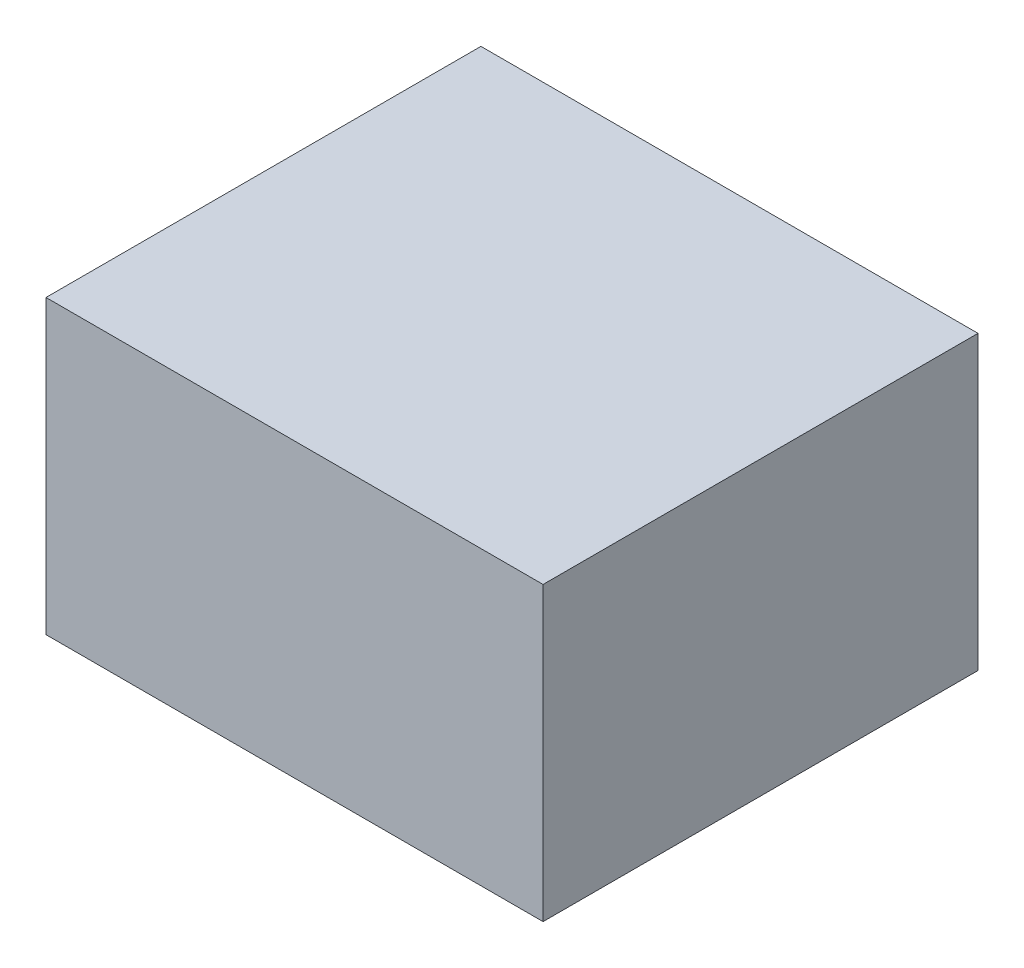
ISO-10303-21;
HEADER;
FILE_DESCRIPTION(('STEP AP214'),'2;1');
FILE_NAME('part.step','',(''),(''),'','','');
FILE_SCHEMA(('AUTOMOTIVE_DESIGN { 1 0 10303 214 1 1 1 1 }'));
ENDSEC;
DATA;
#1=APPLICATION_CONTEXT('core data for automotive mechanical design processes');
#2=APPLICATION_PROTOCOL_DEFINITION('international standard','automotive_design',2000,#1);
#3=PRODUCT_CONTEXT('',#1,'mechanical');
#4=PRODUCT('Part','Part','',(#3));
#5=PRODUCT_RELATED_PRODUCT_CATEGORY('part','',(#4));
#6=PRODUCT_DEFINITION_FORMATION('','',#4);
#7=PRODUCT_DEFINITION_CONTEXT('part definition',#1,'design');
#8=PRODUCT_DEFINITION('design','',#6,#7);
#9=PRODUCT_DEFINITION_SHAPE('','',#8);
#10=(LENGTH_UNIT() NAMED_UNIT(*) SI_UNIT(.MILLI.,.METRE.));
#11=(NAMED_UNIT(*) PLANE_ANGLE_UNIT() SI_UNIT($,.RADIAN.));
#12=(NAMED_UNIT(*) SI_UNIT($,.STERADIAN.) SOLID_ANGLE_UNIT());
#13=UNCERTAINTY_MEASURE_WITH_UNIT(LENGTH_MEASURE(1.E-05),#10,'distance_accuracy_value','');
#14=(GEOMETRIC_REPRESENTATION_CONTEXT(3) GLOBAL_UNCERTAINTY_ASSIGNED_CONTEXT((#13)) GLOBAL_UNIT_ASSIGNED_CONTEXT((#10,
#11,#12)) REPRESENTATION_CONTEXT('',''));
#15=CARTESIAN_POINT('',(0.,0.,0.));
#16=DIRECTION('',(0.,0.,1.));
#17=DIRECTION('',(1.,0.,0.));
#18=AXIS2_PLACEMENT_3D('',#15,#16,#17);
#19=CARTESIAN_POINT('',(0.,0.,7.));
#20=DIRECTION('',(-1.,0.,0.));
#21=DIRECTION('',(0.,0.,1.));
#22=AXIS2_PLACEMENT_3D('',#19,#20,#21);
#23=PLANE('',#22);
#24=DIRECTION('',(0.,1.,0.));
#25=VECTOR('',#24,1.);
#26=CARTESIAN_POINT('',(0.,0.,0.));
#27=LINE('',#26,#25);
#28=CARTESIAN_POINT('',(0.,0.,0.));
#29=VERTEX_POINT('',#28);
#30=CARTESIAN_POINT('',(0.,4.7,0.));
#31=VERTEX_POINT('',#30);
#32=EDGE_CURVE('E107',#29,#31,#27,.T.);
#33=ORIENTED_EDGE('',*,*,#32,.T.);
#34=DIRECTION('',(0.,0.,-1.));
#35=VECTOR('',#34,1.);
#36=CARTESIAN_POINT('',(0.,4.7,7.));
#37=LINE('',#36,#35);
#38=CARTESIAN_POINT('',(0.,4.7,7.));
#39=VERTEX_POINT('',#38);
#40=EDGE_CURVE('E11',#39,#31,#37,.T.);
#41=ORIENTED_EDGE('',*,*,#40,.F.);
#42=DIRECTION('',(0.,1.,0.));
#43=VECTOR('',#42,1.);
#44=CARTESIAN_POINT('',(0.,0.,7.));
#45=LINE('',#44,#43);
#46=CARTESIAN_POINT('',(0.,0.,7.));
#47=VERTEX_POINT('',#46);
#48=EDGE_CURVE('E91',#47,#39,#45,.T.);
#49=ORIENTED_EDGE('',*,*,#48,.F.);
#50=DIRECTION('',(0.,0.,-1.));
#51=VECTOR('',#50,1.);
#52=CARTESIAN_POINT('',(0.,0.,7.));
#53=LINE('',#52,#51);
#54=EDGE_CURVE('E103',#47,#29,#53,.T.);
#55=ORIENTED_EDGE('',*,*,#54,.T.);
#56=EDGE_LOOP('',(#33,#41,#49,#55));
#57=FACE_BOUND('',#56,.T.);
#58=ADVANCED_FACE('F39',(#57),#23,.F.);
#59=CARTESIAN_POINT('',(0.,4.7,7.));
#60=DIRECTION('',(0.,-1.,0.));
#61=DIRECTION('',(1.,0.,0.));
#62=AXIS2_PLACEMENT_3D('',#59,#60,#61);
#63=PLANE('',#62);
#64=DIRECTION('',(-1.,0.,0.));
#65=VECTOR('',#64,1.);
#66=CARTESIAN_POINT('',(0.,4.7,0.));
#67=LINE('',#66,#65);
#68=CARTESIAN_POINT('',(-8.,4.7,0.));
#69=VERTEX_POINT('',#68);
#70=EDGE_CURVE('E96',#31,#69,#67,.T.);
#71=ORIENTED_EDGE('',*,*,#70,.T.);
#72=DIRECTION('',(0.,0.,-1.));
#73=VECTOR('',#72,1.);
#74=CARTESIAN_POINT('',(-8.,4.7,7.));
#75=LINE('',#74,#73);
#76=CARTESIAN_POINT('',(-8.,4.7,7.));
#77=VERTEX_POINT('',#76);
#78=EDGE_CURVE('E48',#77,#69,#75,.T.);
#79=ORIENTED_EDGE('',*,*,#78,.F.);
#80=DIRECTION('',(-1.,0.,0.));
#81=VECTOR('',#80,1.);
#82=CARTESIAN_POINT('',(0.,4.7,7.));
#83=LINE('',#82,#81);
#84=EDGE_CURVE('E86',#39,#77,#83,.T.);
#85=ORIENTED_EDGE('',*,*,#84,.F.);
#86=ORIENTED_EDGE('',*,*,#40,.T.);
#87=EDGE_LOOP('',(#71,#79,#85,#86));
#88=FACE_BOUND('',#87,.T.);
#89=ADVANCED_FACE('F95',(#88),#63,.F.);
#90=CARTESIAN_POINT('',(-8.,0.,7.));
#91=DIRECTION('',(1.,0.,0.));
#92=DIRECTION('',(0.,0.,-1.));
#93=AXIS2_PLACEMENT_3D('',#90,#91,#92);
#94=PLANE('',#93);
#95=DIRECTION('',(0.,-1.,0.));
#96=VECTOR('',#95,1.);
#97=CARTESIAN_POINT('',(-8.,0.,0.));
#98=LINE('',#97,#96);
#99=CARTESIAN_POINT('',(-8.,0.,0.));
#100=VERTEX_POINT('',#99);
#101=EDGE_CURVE('E73',#69,#100,#98,.T.);
#102=ORIENTED_EDGE('',*,*,#101,.T.);
#103=DIRECTION('',(0.,0.,-1.));
#104=VECTOR('',#103,1.);
#105=CARTESIAN_POINT('',(-8.,0.,7.));
#106=LINE('',#105,#104);
#107=CARTESIAN_POINT('',(-8.,0.,7.));
#108=VERTEX_POINT('',#107);
#109=EDGE_CURVE('E98',#108,#100,#106,.T.);
#110=ORIENTED_EDGE('',*,*,#109,.F.);
#111=DIRECTION('',(0.,-1.,0.));
#112=VECTOR('',#111,1.);
#113=CARTESIAN_POINT('',(-8.,0.,7.));
#114=LINE('',#113,#112);
#115=EDGE_CURVE('E89',#77,#108,#114,.T.);
#116=ORIENTED_EDGE('',*,*,#115,.F.);
#117=ORIENTED_EDGE('',*,*,#78,.T.);
#118=EDGE_LOOP('',(#102,#110,#116,#117));
#119=FACE_BOUND('',#118,.T.);
#120=ADVANCED_FACE('F99',(#119),#94,.F.);
#121=CARTESIAN_POINT('',(0.,0.,7.));
#122=DIRECTION('',(0.,1.,0.));
#123=DIRECTION('',(-1.,0.,0.));
#124=AXIS2_PLACEMENT_3D('',#121,#122,#123);
#125=PLANE('',#124);
#126=DIRECTION('',(1.,0.,0.));
#127=VECTOR('',#126,1.);
#128=CARTESIAN_POINT('',(0.,0.,0.));
#129=LINE('',#128,#127);
#130=EDGE_CURVE('E79',#100,#29,#129,.T.);
#131=ORIENTED_EDGE('',*,*,#130,.T.);
#132=ORIENTED_EDGE('',*,*,#54,.F.);
#133=DIRECTION('',(1.,0.,0.));
#134=VECTOR('',#133,1.);
#135=CARTESIAN_POINT('',(0.,0.,7.));
#136=LINE('',#135,#134);
#137=EDGE_CURVE('E56',#108,#47,#136,.T.);
#138=ORIENTED_EDGE('',*,*,#137,.F.);
#139=ORIENTED_EDGE('',*,*,#109,.T.);
#140=EDGE_LOOP('',(#131,#132,#138,#139));
#141=FACE_BOUND('',#140,.T.);
#142=ADVANCED_FACE('F120',(#141),#125,.F.);
#143=CARTESIAN_POINT('',(0.,0.,7.));
#144=DIRECTION('',(0.,0.,1.));
#145=DIRECTION('',(1.,0.,0.));
#146=AXIS2_PLACEMENT_3D('',#143,#144,#145);
#147=PLANE('',#146);
#148=ORIENTED_EDGE('',*,*,#48,.T.);
#149=ORIENTED_EDGE('',*,*,#84,.T.);
#150=ORIENTED_EDGE('',*,*,#115,.T.);
#151=ORIENTED_EDGE('',*,*,#137,.T.);
#152=EDGE_LOOP('',(#148,#149,#150,#151));
#153=FACE_BOUND('',#152,.T.);
#154=ADVANCED_FACE('F87',(#153),#147,.T.);
#155=CARTESIAN_POINT('',(0.,0.,0.));
#156=DIRECTION('',(0.,0.,1.));
#157=DIRECTION('',(1.,0.,0.));
#158=AXIS2_PLACEMENT_3D('',#155,#156,#157);
#159=PLANE('',#158);
#160=ORIENTED_EDGE('',*,*,#32,.F.);
#161=ORIENTED_EDGE('',*,*,#130,.F.);
#162=ORIENTED_EDGE('',*,*,#101,.F.);
#163=ORIENTED_EDGE('',*,*,#70,.F.);
#164=EDGE_LOOP('',(#160,#161,#162,#163));
#165=FACE_BOUND('',#164,.T.);
#166=ADVANCED_FACE('F123',(#165),#159,.F.);
#167=CLOSED_SHELL('',(#58,#89,#120,#142,#154,#166));
#168=MANIFOLD_SOLID_BREP('B2',#167);
#169=ADVANCED_BREP_SHAPE_REPRESENTATION('',(#18,#168),#14);
#170=SHAPE_DEFINITION_REPRESENTATION(#9,#169);
ENDSEC;
END-ISO-10303-21;
